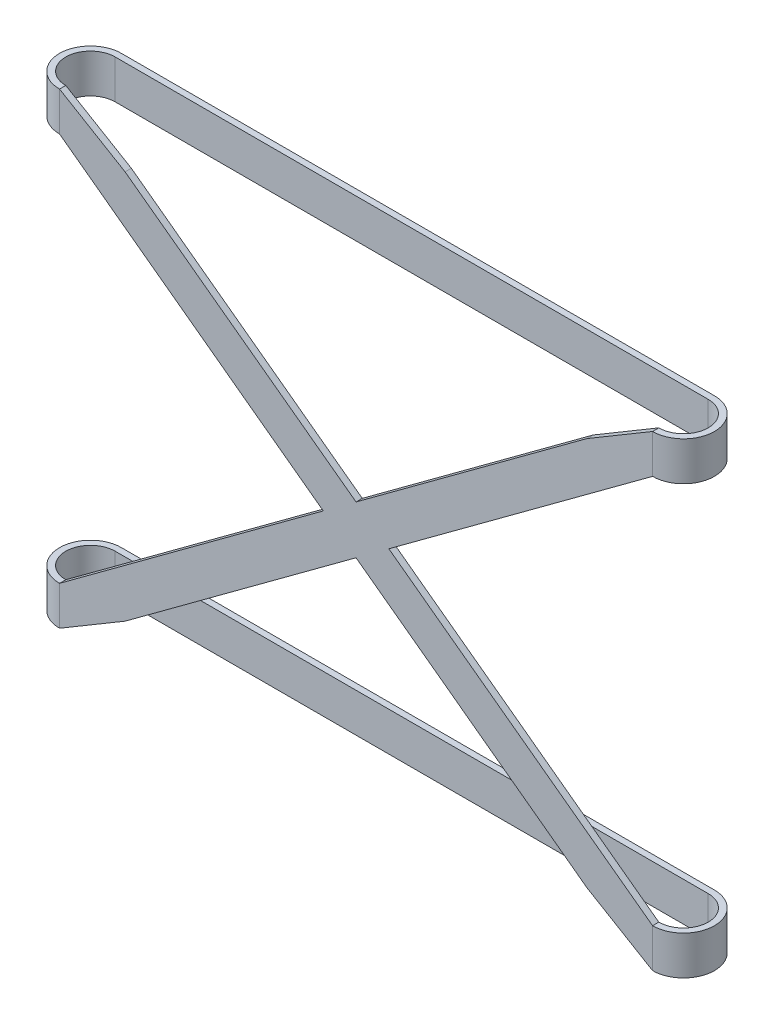
ISO-10303-21;
HEADER;
FILE_DESCRIPTION(('STEP AP214'),'2;1');
FILE_NAME('part.step','',(''),(''),'','','');
FILE_SCHEMA(('AUTOMOTIVE_DESIGN { 1 0 10303 214 1 1 1 1 }'));
ENDSEC;
DATA;
#1=APPLICATION_CONTEXT('core data for automotive mechanical design processes');
#2=APPLICATION_PROTOCOL_DEFINITION('international standard','automotive_design',2000,#1);
#3=PRODUCT_CONTEXT('',#1,'mechanical');
#4=PRODUCT('Part','Part','',(#3));
#5=PRODUCT_RELATED_PRODUCT_CATEGORY('part','',(#4));
#6=PRODUCT_DEFINITION_FORMATION('','',#4);
#7=PRODUCT_DEFINITION_CONTEXT('part definition',#1,'design');
#8=PRODUCT_DEFINITION('design','',#6,#7);
#9=PRODUCT_DEFINITION_SHAPE('','',#8);
#10=(LENGTH_UNIT() NAMED_UNIT(*) SI_UNIT(.MILLI.,.METRE.));
#11=(NAMED_UNIT(*) PLANE_ANGLE_UNIT() SI_UNIT($,.RADIAN.));
#12=(NAMED_UNIT(*) SI_UNIT($,.STERADIAN.) SOLID_ANGLE_UNIT());
#13=UNCERTAINTY_MEASURE_WITH_UNIT(LENGTH_MEASURE(1.E-05),#10,'distance_accuracy_value','');
#14=(GEOMETRIC_REPRESENTATION_CONTEXT(3) GLOBAL_UNCERTAINTY_ASSIGNED_CONTEXT((#13)) GLOBAL_UNIT_ASSIGNED_CONTEXT((#10,
#11,#12)) REPRESENTATION_CONTEXT('',''));
#15=CARTESIAN_POINT('',(0.,0.,0.));
#16=DIRECTION('',(0.,0.,1.));
#17=DIRECTION('',(1.,0.,0.));
#18=AXIS2_PLACEMENT_3D('',#15,#16,#17);
#19=CARTESIAN_POINT('',(0.,30.,-3.175));
#20=DIRECTION('',(0.,0.,1.));
#21=DIRECTION('',(1.,0.,0.));
#22=AXIS2_PLACEMENT_3D('',#19,#20,#21);
#23=PLANE('',#22);
#24=DIRECTION('',(1.,0.,0.));
#25=VECTOR('',#24,1.);
#26=CARTESIAN_POINT('',(0.,-30.,-3.175));
#27=LINE('',#26,#25);
#28=CARTESIAN_POINT('',(0.,-30.,-3.175));
#29=VERTEX_POINT('',#28);
#30=CARTESIAN_POINT('',(76.2,-30.,-3.175));
#31=VERTEX_POINT('',#30);
#32=EDGE_CURVE('E242',#29,#31,#27,.T.);
#33=ORIENTED_EDGE('',*,*,#32,.T.);
#34=DIRECTION('',(0.,-1.,0.));
#35=VECTOR('',#34,1.);
#36=CARTESIAN_POINT('',(76.2,30.,-3.175));
#37=LINE('',#36,#35);
#38=CARTESIAN_POINT('',(76.2,-25.,-3.175));
#39=VERTEX_POINT('',#38);
#40=EDGE_CURVE('E197',#31,#39,#37,.F.);
#41=ORIENTED_EDGE('',*,*,#40,.T.);
#42=DIRECTION('',(1.,0.,0.));
#43=VECTOR('',#42,1.);
#44=CARTESIAN_POINT('',(67.7775335807773,-25.,-3.175));
#45=LINE('',#44,#43);
#46=CARTESIAN_POINT('',(0.,-25.,-3.175));
#47=VERTEX_POINT('',#46);
#48=EDGE_CURVE('E246',#39,#47,#45,.F.);
#49=ORIENTED_EDGE('',*,*,#48,.T.);
#50=DIRECTION('',(0.,-1.,0.));
#51=VECTOR('',#50,1.);
#52=CARTESIAN_POINT('',(0.,30.,-3.175));
#53=LINE('',#52,#51);
#54=EDGE_CURVE('E141',#47,#29,#53,.T.);
#55=ORIENTED_EDGE('',*,*,#54,.T.);
#56=EDGE_LOOP('',(#33,#41,#49,#55));
#57=FACE_BOUND('',#56,.T.);
#58=ADVANCED_FACE('F16',(#57),#23,.T.);
#59=CARTESIAN_POINT('',(76.2,30.,0.));
#60=DIRECTION('',(0.,-1.,0.));
#61=DIRECTION('',(0.,0.,-1.));
#62=AXIS2_PLACEMENT_3D('',#59,#60,#61);
#63=CYLINDRICAL_SURFACE('',#62,3.175);
#64=ORIENTED_EDGE('',*,*,#40,.F.);
#65=CARTESIAN_POINT('',(76.2,-30.,0.));
#66=DIRECTION('',(0.,-1.,0.));
#67=DIRECTION('',(0.,0.,-1.));
#68=AXIS2_PLACEMENT_3D('',#65,#66,#67);
#69=CIRCLE('',#68,3.175);
#70=CARTESIAN_POINT('',(76.2,-30.,3.17500000000002));
#71=VERTEX_POINT('',#70);
#72=EDGE_CURVE('E238',#31,#71,#69,.T.);
#73=ORIENTED_EDGE('',*,*,#72,.T.);
#74=DIRECTION('',(0.,1.,0.));
#75=VECTOR('',#74,1.);
#76=CARTESIAN_POINT('',(76.2,30.,3.175));
#77=LINE('',#76,#75);
#78=CARTESIAN_POINT('',(76.2,-25.,3.175));
#79=VERTEX_POINT('',#78);
#80=EDGE_CURVE('E181',#79,#71,#77,.F.);
#81=ORIENTED_EDGE('',*,*,#80,.F.);
#82=CARTESIAN_POINT('',(76.2,-25.,0.));
#83=DIRECTION('',(0.,-1.,0.));
#84=DIRECTION('',(0.,0.,-1.));
#85=AXIS2_PLACEMENT_3D('',#82,#83,#84);
#86=CIRCLE('',#85,3.175);
#87=EDGE_CURVE('E156',#79,#39,#86,.F.);
#88=ORIENTED_EDGE('',*,*,#87,.T.);
#89=EDGE_LOOP('',(#64,#73,#81,#88));
#90=FACE_BOUND('',#89,.T.);
#91=ADVANCED_FACE('F758',(#90),#63,.F.);
#92=CARTESIAN_POINT('',(0.,30.,0.));
#93=DIRECTION('',(0.,-1.,0.));
#94=DIRECTION('',(0.,0.,-1.));
#95=AXIS2_PLACEMENT_3D('',#92,#93,#94);
#96=CYLINDRICAL_SURFACE('',#95,3.175);
#97=DIRECTION('',(0.,1.,0.));
#98=VECTOR('',#97,1.);
#99=CARTESIAN_POINT('',(0.,30.,3.175));
#100=LINE('',#99,#98);
#101=CARTESIAN_POINT('',(0.,-30.,3.175));
#102=VERTEX_POINT('',#101);
#103=CARTESIAN_POINT('',(0.,-25.,3.175));
#104=VERTEX_POINT('',#103);
#105=EDGE_CURVE('E173',#102,#104,#100,.T.);
#106=ORIENTED_EDGE('',*,*,#105,.F.);
#107=CARTESIAN_POINT('',(0.,-30.,0.));
#108=DIRECTION('',(0.,-1.,0.));
#109=DIRECTION('',(0.,0.,-1.));
#110=AXIS2_PLACEMENT_3D('',#107,#108,#109);
#111=CIRCLE('',#110,3.175);
#112=EDGE_CURVE('E243',#102,#29,#111,.T.);
#113=ORIENTED_EDGE('',*,*,#112,.T.);
#114=ORIENTED_EDGE('',*,*,#54,.F.);
#115=CARTESIAN_POINT('',(0.,-25.,0.));
#116=DIRECTION('',(0.,-1.,0.));
#117=DIRECTION('',(0.,0.,-1.));
#118=AXIS2_PLACEMENT_3D('',#115,#116,#117);
#119=CIRCLE('',#118,3.175);
#120=EDGE_CURVE('E19',#47,#104,#119,.F.);
#121=ORIENTED_EDGE('',*,*,#120,.T.);
#122=EDGE_LOOP('',(#106,#113,#114,#121));
#123=FACE_BOUND('',#122,.T.);
#124=ADVANCED_FACE('F183',(#123),#96,.F.);
#125=CARTESIAN_POINT('',(0.,30.,0.));
#126=DIRECTION('',(0.,-1.,0.));
#127=DIRECTION('',(0.,0.,-1.));
#128=AXIS2_PLACEMENT_3D('',#125,#126,#127);
#129=CYLINDRICAL_SURFACE('',#128,3.175);
#130=DIRECTION('',(0.,1.,0.));
#131=VECTOR('',#130,1.);
#132=CARTESIAN_POINT('',(0.,30.,-3.175));
#133=LINE('',#132,#131);
#134=CARTESIAN_POINT('',(0.,30.,-3.175));
#135=VERTEX_POINT('',#134);
#136=CARTESIAN_POINT('',(0.,25.,-3.175));
#137=VERTEX_POINT('',#136);
#138=EDGE_CURVE('E186',#135,#137,#133,.F.);
#139=ORIENTED_EDGE('',*,*,#138,.F.);
#140=CARTESIAN_POINT('',(0.,30.,0.));
#141=DIRECTION('',(0.,-1.,0.));
#142=DIRECTION('',(0.,0.,-1.));
#143=AXIS2_PLACEMENT_3D('',#140,#141,#142);
#144=CIRCLE('',#143,3.175);
#145=CARTESIAN_POINT('',(0.,30.,3.175));
#146=VERTEX_POINT('',#145);
#147=EDGE_CURVE('E228',#146,#135,#144,.T.);
#148=ORIENTED_EDGE('',*,*,#147,.F.);
#149=DIRECTION('',(0.,1.,0.));
#150=VECTOR('',#149,1.);
#151=CARTESIAN_POINT('',(0.,30.,3.175));
#152=LINE('',#151,#150);
#153=CARTESIAN_POINT('',(0.,25.,3.175));
#154=VERTEX_POINT('',#153);
#155=EDGE_CURVE('E180',#154,#146,#152,.T.);
#156=ORIENTED_EDGE('',*,*,#155,.F.);
#157=CARTESIAN_POINT('',(0.,25.,0.));
#158=DIRECTION('',(0.,-1.,0.));
#159=DIRECTION('',(0.,0.,-1.));
#160=AXIS2_PLACEMENT_3D('',#157,#158,#159);
#161=CIRCLE('',#160,3.175);
#162=EDGE_CURVE('E231',#154,#137,#161,.T.);
#163=ORIENTED_EDGE('',*,*,#162,.T.);
#164=EDGE_LOOP('',(#139,#148,#156,#163));
#165=FACE_BOUND('',#164,.T.);
#166=ADVANCED_FACE('F506',(#165),#129,.F.);
#167=CARTESIAN_POINT('',(0.,30.,-3.175));
#168=DIRECTION('',(0.,0.,1.));
#169=DIRECTION('',(1.,0.,0.));
#170=AXIS2_PLACEMENT_3D('',#167,#168,#169);
#171=PLANE('',#170);
#172=DIRECTION('',(1.,0.,0.));
#173=VECTOR('',#172,1.);
#174=CARTESIAN_POINT('',(0.,30.,-3.175));
#175=LINE('',#174,#173);
#176=CARTESIAN_POINT('',(76.2,30.,-3.175));
#177=VERTEX_POINT('',#176);
#178=EDGE_CURVE('E227',#135,#177,#175,.T.);
#179=ORIENTED_EDGE('',*,*,#178,.F.);
#180=ORIENTED_EDGE('',*,*,#138,.T.);
#181=DIRECTION('',(1.,0.,0.));
#182=VECTOR('',#181,1.);
#183=CARTESIAN_POINT('',(67.7775335807773,25.,-3.175));
#184=LINE('',#183,#182);
#185=CARTESIAN_POINT('',(76.2,25.,-3.175));
#186=VERTEX_POINT('',#185);
#187=EDGE_CURVE('E234',#137,#186,#184,.T.);
#188=ORIENTED_EDGE('',*,*,#187,.T.);
#189=DIRECTION('',(0.,-1.,0.));
#190=VECTOR('',#189,1.);
#191=CARTESIAN_POINT('',(76.2,30.,-3.175));
#192=LINE('',#191,#190);
#193=EDGE_CURVE('E184',#186,#177,#192,.F.);
#194=ORIENTED_EDGE('',*,*,#193,.T.);
#195=EDGE_LOOP('',(#179,#180,#188,#194));
#196=FACE_BOUND('',#195,.T.);
#197=ADVANCED_FACE('F526',(#196),#171,.T.);
#198=CARTESIAN_POINT('',(76.2,30.,0.));
#199=DIRECTION('',(0.,-1.,0.));
#200=DIRECTION('',(0.,0.,-1.));
#201=AXIS2_PLACEMENT_3D('',#198,#199,#200);
#202=CYLINDRICAL_SURFACE('',#201,3.175);
#203=DIRECTION('',(0.,1.,0.));
#204=VECTOR('',#203,1.);
#205=CARTESIAN_POINT('',(76.2,30.,3.175));
#206=LINE('',#205,#204);
#207=CARTESIAN_POINT('',(76.2,30.,3.175));
#208=VERTEX_POINT('',#207);
#209=CARTESIAN_POINT('',(76.2,25.,3.175));
#210=VERTEX_POINT('',#209);
#211=EDGE_CURVE('E241',#208,#210,#206,.F.);
#212=ORIENTED_EDGE('',*,*,#211,.F.);
#213=CARTESIAN_POINT('',(76.2,30.,0.));
#214=DIRECTION('',(0.,-1.,0.));
#215=DIRECTION('',(0.,0.,-1.));
#216=AXIS2_PLACEMENT_3D('',#213,#214,#215);
#217=CIRCLE('',#216,3.175);
#218=EDGE_CURVE('E224',#177,#208,#217,.T.);
#219=ORIENTED_EDGE('',*,*,#218,.F.);
#220=ORIENTED_EDGE('',*,*,#193,.F.);
#221=CARTESIAN_POINT('',(76.2,25.,0.));
#222=DIRECTION('',(0.,-1.,0.));
#223=DIRECTION('',(0.,0.,-1.));
#224=AXIS2_PLACEMENT_3D('',#221,#222,#223);
#225=CIRCLE('',#224,3.175);
#226=EDGE_CURVE('E235',#186,#210,#225,.T.);
#227=ORIENTED_EDGE('',*,*,#226,.T.);
#228=EDGE_LOOP('',(#212,#219,#220,#227));
#229=FACE_BOUND('',#228,.T.);
#230=ADVANCED_FACE('F525',(#229),#202,.F.);
#231=CARTESIAN_POINT('',(67.7775335807773,-25.,3.975));
#232=DIRECTION('',(0.,-1.,0.));
#233=DIRECTION('',(0.,0.,-1.));
#234=AXIS2_PLACEMENT_3D('',#231,#232,#233);
#235=PLANE('',#234);
#236=ORIENTED_EDGE('',*,*,#87,.F.);
#237=DIRECTION('',(0.,0.,1.));
#238=VECTOR('',#237,1.);
#239=CARTESIAN_POINT('',(76.2,-25.,3.975));
#240=LINE('',#239,#238);
#241=CARTESIAN_POINT('',(76.2,-25.,3.975));
#242=VERTEX_POINT('',#241);
#243=EDGE_CURVE('E317',#79,#242,#240,.T.);
#244=ORIENTED_EDGE('',*,*,#243,.T.);
#245=CARTESIAN_POINT('',(76.2,-25.,0.));
#246=DIRECTION('',(0.,-1.,0.));
#247=DIRECTION('',(0.,0.,-1.));
#248=AXIS2_PLACEMENT_3D('',#245,#246,#247);
#249=CIRCLE('',#248,3.975);
#250=CARTESIAN_POINT('',(76.2,-25.,-3.975));
#251=VERTEX_POINT('',#250);
#252=EDGE_CURVE('E221',#251,#242,#249,.T.);
#253=ORIENTED_EDGE('',*,*,#252,.F.);
#254=DIRECTION('',(1.,0.,0.));
#255=VECTOR('',#254,1.);
#256=CARTESIAN_POINT('',(0.,-25.,-3.975));
#257=LINE('',#256,#255);
#258=CARTESIAN_POINT('',(0.,-25.,-3.975));
#259=VERTEX_POINT('',#258);
#260=EDGE_CURVE('E249',#251,#259,#257,.F.);
#261=ORIENTED_EDGE('',*,*,#260,.T.);
#262=CARTESIAN_POINT('',(0.,-25.,0.));
#263=DIRECTION('',(0.,-1.,0.));
#264=DIRECTION('',(0.,0.,-1.));
#265=AXIS2_PLACEMENT_3D('',#262,#263,#264);
#266=CIRCLE('',#265,3.975);
#267=CARTESIAN_POINT('',(0.,-25.,3.975));
#268=VERTEX_POINT('',#267);
#269=EDGE_CURVE('E152',#268,#259,#266,.T.);
#270=ORIENTED_EDGE('',*,*,#269,.F.);
#271=DIRECTION('',(0.,0.,-1.));
#272=VECTOR('',#271,1.);
#273=CARTESIAN_POINT('',(0.,-25.,3.975));
#274=LINE('',#273,#272);
#275=EDGE_CURVE('E146',#104,#268,#274,.F.);
#276=ORIENTED_EDGE('',*,*,#275,.F.);
#277=ORIENTED_EDGE('',*,*,#120,.F.);
#278=ORIENTED_EDGE('',*,*,#48,.F.);
#279=EDGE_LOOP('',(#236,#244,#253,#261,#270,#276,#277,#278));
#280=FACE_BOUND('',#279,.T.);
#281=ADVANCED_FACE('F148',(#280),#235,.F.);
#282=CARTESIAN_POINT('',(0.,30.,-3.975));
#283=DIRECTION('',(0.,0.,1.));
#284=DIRECTION('',(1.,0.,0.));
#285=AXIS2_PLACEMENT_3D('',#282,#283,#284);
#286=PLANE('',#285);
#287=ORIENTED_EDGE('',*,*,#260,.F.);
#288=DIRECTION('',(0.,-1.,0.));
#289=VECTOR('',#288,1.);
#290=CARTESIAN_POINT('',(76.2,30.,-3.975));
#291=LINE('',#290,#289);
#292=CARTESIAN_POINT('',(76.2,-30.,-3.975));
#293=VERTEX_POINT('',#292);
#294=EDGE_CURVE('E220',#293,#251,#291,.F.);
#295=ORIENTED_EDGE('',*,*,#294,.F.);
#296=DIRECTION('',(1.,0.,0.));
#297=VECTOR('',#296,1.);
#298=CARTESIAN_POINT('',(0.,-30.,-3.975));
#299=LINE('',#298,#297);
#300=CARTESIAN_POINT('',(0.,-30.,-3.975));
#301=VERTEX_POINT('',#300);
#302=EDGE_CURVE('E244',#293,#301,#299,.F.);
#303=ORIENTED_EDGE('',*,*,#302,.T.);
#304=DIRECTION('',(0.,-1.,0.));
#305=VECTOR('',#304,1.);
#306=CARTESIAN_POINT('',(0.,30.,-3.975));
#307=LINE('',#306,#305);
#308=EDGE_CURVE('E214',#259,#301,#307,.T.);
#309=ORIENTED_EDGE('',*,*,#308,.F.);
#310=EDGE_LOOP('',(#287,#295,#303,#309));
#311=FACE_BOUND('',#310,.T.);
#312=ADVANCED_FACE('F459',(#311),#286,.F.);
#313=CARTESIAN_POINT('',(0.,-30.,0.));
#314=DIRECTION('',(0.,1.,0.));
#315=DIRECTION('',(0.,0.,1.));
#316=AXIS2_PLACEMENT_3D('',#313,#314,#315);
#317=PLANE('',#316);
#318=DIRECTION('',(0.,0.,1.));
#319=VECTOR('',#318,1.);
#320=CARTESIAN_POINT('',(76.2,-30.,-73.1888658005211));
#321=LINE('',#320,#319);
#322=CARTESIAN_POINT('',(76.2,-30.,3.975));
#323=VERTEX_POINT('',#322);
#324=EDGE_CURVE('E296',#323,#71,#321,.F.);
#325=ORIENTED_EDGE('',*,*,#324,.T.);
#326=ORIENTED_EDGE('',*,*,#72,.F.);
#327=ORIENTED_EDGE('',*,*,#32,.F.);
#328=ORIENTED_EDGE('',*,*,#112,.F.);
#329=DIRECTION('',(0.,0.,1.));
#330=VECTOR('',#329,1.);
#331=CARTESIAN_POINT('',(0.,-30.,-73.1888658005211));
#332=LINE('',#331,#330);
#333=CARTESIAN_POINT('',(0.,-30.,3.975));
#334=VERTEX_POINT('',#333);
#335=EDGE_CURVE('E260',#102,#334,#332,.T.);
#336=ORIENTED_EDGE('',*,*,#335,.T.);
#337=CARTESIAN_POINT('',(0.,-30.,0.));
#338=DIRECTION('',(0.,-1.,0.));
#339=DIRECTION('',(0.,0.,-1.));
#340=AXIS2_PLACEMENT_3D('',#337,#338,#339);
#341=CIRCLE('',#340,3.975);
#342=EDGE_CURVE('E169',#301,#334,#341,.F.);
#343=ORIENTED_EDGE('',*,*,#342,.F.);
#344=ORIENTED_EDGE('',*,*,#302,.F.);
#345=CARTESIAN_POINT('',(76.2,-30.,0.));
#346=DIRECTION('',(0.,-1.,0.));
#347=DIRECTION('',(0.,0.,-1.));
#348=AXIS2_PLACEMENT_3D('',#345,#346,#347);
#349=CIRCLE('',#348,3.975);
#350=EDGE_CURVE('E217',#323,#293,#349,.F.);
#351=ORIENTED_EDGE('',*,*,#350,.F.);
#352=EDGE_LOOP('',(#325,#326,#327,#328,#336,#343,#344,#351));
#353=FACE_BOUND('',#352,.T.);
#354=ADVANCED_FACE('F452',(#353),#317,.F.);
#355=CARTESIAN_POINT('',(0.,30.,3.175));
#356=DIRECTION('',(0.,0.,-1.));
#357=DIRECTION('',(-1.,0.,0.));
#358=AXIS2_PLACEMENT_3D('',#355,#356,#357);
#359=PLANE('',#358);
#360=DIRECTION('',(0.804723108495723,-0.593650333658611,0.));
#361=VECTOR('',#360,1.);
#362=CARTESIAN_POINT('',(38.1,3.10665864271411,3.175));
#363=LINE('',#362,#361);
#364=CARTESIAN_POINT('',(8.4224664192227,25.,3.175));
#365=VERTEX_POINT('',#364);
#366=CARTESIAN_POINT('',(38.1,3.10665864271411,3.175));
#367=VERTEX_POINT('',#366);
#368=EDGE_CURVE('E366',#365,#367,#363,.T.);
#369=ORIENTED_EDGE('',*,*,#368,.T.);
#370=DIRECTION('',(0.804723108495723,0.593650333658611,0.));
#371=VECTOR('',#370,1.);
#372=CARTESIAN_POINT('',(38.1,3.10665864271411,3.175));
#373=LINE('',#372,#371);
#374=CARTESIAN_POINT('',(67.7775335807773,25.,3.175));
#375=VERTEX_POINT('',#374);
#376=EDGE_CURVE('E351',#367,#375,#373,.T.);
#377=ORIENTED_EDGE('',*,*,#376,.T.);
#378=DIRECTION('',(0.859892363898923,0.510475388739088,0.));
#379=VECTOR('',#378,1.);
#380=CARTESIAN_POINT('',(67.7775335807773,25.,3.175));
#381=LINE('',#380,#379);
#382=EDGE_CURVE('E338',#375,#208,#381,.T.);
#383=ORIENTED_EDGE('',*,*,#382,.T.);
#384=ORIENTED_EDGE('',*,*,#211,.T.);
#385=DIRECTION('',(-0.804723108495723,-0.593650333658611,0.));
#386=VECTOR('',#385,1.);
#387=CARTESIAN_POINT('',(76.2,25.,3.175));
#388=LINE('',#387,#386);
#389=CARTESIAN_POINT('',(42.3112332096113,0.,3.175));
#390=VERTEX_POINT('',#389);
#391=EDGE_CURVE('E194',#210,#390,#388,.T.);
#392=ORIENTED_EDGE('',*,*,#391,.T.);
#393=DIRECTION('',(0.804723108495723,-0.593650333658611,0.));
#394=VECTOR('',#393,1.);
#395=CARTESIAN_POINT('',(76.2,-25.,3.175));
#396=LINE('',#395,#394);
#397=EDGE_CURVE('E223',#390,#79,#396,.T.);
#398=ORIENTED_EDGE('',*,*,#397,.T.);
#399=ORIENTED_EDGE('',*,*,#80,.T.);
#400=DIRECTION('',(-0.859892363898923,0.510475388739088,0.));
#401=VECTOR('',#400,1.);
#402=CARTESIAN_POINT('',(67.7775335807773,-25.,3.17500000000001));
#403=LINE('',#402,#401);
#404=CARTESIAN_POINT('',(67.7775335807773,-25.,3.17499999999997));
#405=VERTEX_POINT('',#404);
#406=EDGE_CURVE('E299',#71,#405,#403,.T.);
#407=ORIENTED_EDGE('',*,*,#406,.T.);
#408=DIRECTION('',(-0.804723108495723,0.593650333658611,0.));
#409=VECTOR('',#408,1.);
#410=CARTESIAN_POINT('',(67.7775335807773,-25.,3.17499999999996));
#411=LINE('',#410,#409);
#412=CARTESIAN_POINT('',(38.1,-3.1066586427141,3.17499999999999));
#413=VERTEX_POINT('',#412);
#414=EDGE_CURVE('E274',#405,#413,#411,.T.);
#415=ORIENTED_EDGE('',*,*,#414,.T.);
#416=DIRECTION('',(-0.804723108495723,-0.593650333658611,0.));
#417=VECTOR('',#416,1.);
#418=CARTESIAN_POINT('',(38.1,-3.1066586427141,3.175));
#419=LINE('',#418,#417);
#420=CARTESIAN_POINT('',(8.4224664192227,-25.,3.175));
#421=VERTEX_POINT('',#420);
#422=EDGE_CURVE('E261',#413,#421,#419,.T.);
#423=ORIENTED_EDGE('',*,*,#422,.T.);
#424=DIRECTION('',(-0.859892363898923,-0.510475388739087,0.));
#425=VECTOR('',#424,1.);
#426=CARTESIAN_POINT('',(8.4224664192227,-25.,3.175));
#427=LINE('',#426,#425);
#428=EDGE_CURVE('E178',#421,#102,#427,.T.);
#429=ORIENTED_EDGE('',*,*,#428,.T.);
#430=ORIENTED_EDGE('',*,*,#105,.T.);
#431=DIRECTION('',(0.804723108495723,0.593650333658611,0.));
#432=VECTOR('',#431,1.);
#433=CARTESIAN_POINT('',(0.,-25.,3.175));
#434=LINE('',#433,#432);
#435=CARTESIAN_POINT('',(33.8887667903887,0.,3.175));
#436=VERTEX_POINT('',#435);
#437=EDGE_CURVE('E160',#104,#436,#434,.T.);
#438=ORIENTED_EDGE('',*,*,#437,.T.);
#439=DIRECTION('',(-0.804723108495723,0.593650333658611,0.));
#440=VECTOR('',#439,1.);
#441=CARTESIAN_POINT('',(33.8887667903887,0.,3.175));
#442=LINE('',#441,#440);
#443=EDGE_CURVE('E212',#436,#154,#442,.T.);
#444=ORIENTED_EDGE('',*,*,#443,.T.);
#445=ORIENTED_EDGE('',*,*,#155,.T.);
#446=DIRECTION('',(0.859892363898923,-0.510475388739087,0.));
#447=VECTOR('',#446,1.);
#448=CARTESIAN_POINT('',(8.4224664192227,25.,3.175));
#449=LINE('',#448,#447);
#450=EDGE_CURVE('E388',#146,#365,#449,.T.);
#451=ORIENTED_EDGE('',*,*,#450,.T.);
#452=EDGE_LOOP('',(#369,#377,#383,#384,#392,#398,#399,#407,#415,#423,#429,#430,#438,#444,#445,#451));
#453=FACE_BOUND('',#452,.T.);
#454=ADVANCED_FACE('F175',(#453),#359,.T.);
#455=CARTESIAN_POINT('',(67.7775335807773,25.,3.975));
#456=DIRECTION('',(0.,1.,0.));
#457=DIRECTION('',(0.,0.,1.));
#458=AXIS2_PLACEMENT_3D('',#455,#456,#457);
#459=PLANE('',#458);
#460=ORIENTED_EDGE('',*,*,#162,.F.);
#461=DIRECTION('',(0.,0.,1.));
#462=VECTOR('',#461,1.);
#463=CARTESIAN_POINT('',(0.,25.,3.975));
#464=LINE('',#463,#462);
#465=CARTESIAN_POINT('',(0.,25.,3.975));
#466=VERTEX_POINT('',#465);
#467=EDGE_CURVE('E168',#154,#466,#464,.T.);
#468=ORIENTED_EDGE('',*,*,#467,.T.);
#469=CARTESIAN_POINT('',(0.,25.,0.));
#470=DIRECTION('',(0.,-1.,0.));
#471=DIRECTION('',(0.,0.,-1.));
#472=AXIS2_PLACEMENT_3D('',#469,#470,#471);
#473=CIRCLE('',#472,3.975);
#474=CARTESIAN_POINT('',(0.,25.,-3.975));
#475=VERTEX_POINT('',#474);
#476=EDGE_CURVE('E210',#475,#466,#473,.F.);
#477=ORIENTED_EDGE('',*,*,#476,.F.);
#478=DIRECTION('',(1.,0.,0.));
#479=VECTOR('',#478,1.);
#480=CARTESIAN_POINT('',(0.,25.,-3.975));
#481=LINE('',#480,#479);
#482=CARTESIAN_POINT('',(76.2,25.,-3.975));
#483=VERTEX_POINT('',#482);
#484=EDGE_CURVE('E335',#475,#483,#481,.T.);
#485=ORIENTED_EDGE('',*,*,#484,.T.);
#486=CARTESIAN_POINT('',(76.2,25.,0.));
#487=DIRECTION('',(0.,-1.,0.));
#488=DIRECTION('',(0.,0.,-1.));
#489=AXIS2_PLACEMENT_3D('',#486,#487,#488);
#490=CIRCLE('',#489,3.975);
#491=CARTESIAN_POINT('',(76.2,25.,3.975));
#492=VERTEX_POINT('',#491);
#493=EDGE_CURVE('E203',#492,#483,#490,.F.);
#494=ORIENTED_EDGE('',*,*,#493,.F.);
#495=DIRECTION('',(0.,0.,1.));
#496=VECTOR('',#495,1.);
#497=CARTESIAN_POINT('',(76.2,25.,3.975));
#498=LINE('',#497,#496);
#499=EDGE_CURVE('E226',#492,#210,#498,.F.);
#500=ORIENTED_EDGE('',*,*,#499,.T.);
#501=ORIENTED_EDGE('',*,*,#226,.F.);
#502=ORIENTED_EDGE('',*,*,#187,.F.);
#503=EDGE_LOOP('',(#460,#468,#477,#485,#494,#500,#501,#502));
#504=FACE_BOUND('',#503,.T.);
#505=ADVANCED_FACE('F500',(#504),#459,.F.);
#506=CARTESIAN_POINT('',(0.,30.,-3.975));
#507=DIRECTION('',(0.,0.,1.));
#508=DIRECTION('',(1.,0.,0.));
#509=AXIS2_PLACEMENT_3D('',#506,#507,#508);
#510=PLANE('',#509);
#511=ORIENTED_EDGE('',*,*,#484,.F.);
#512=DIRECTION('',(0.,-1.,0.));
#513=VECTOR('',#512,1.);
#514=CARTESIAN_POINT('',(0.,30.,-3.975));
#515=LINE('',#514,#513);
#516=CARTESIAN_POINT('',(0.,30.,-3.975));
#517=VERTEX_POINT('',#516);
#518=EDGE_CURVE('E209',#517,#475,#515,.T.);
#519=ORIENTED_EDGE('',*,*,#518,.F.);
#520=DIRECTION('',(1.,0.,0.));
#521=VECTOR('',#520,1.);
#522=CARTESIAN_POINT('',(0.,30.,-3.975));
#523=LINE('',#522,#521);
#524=CARTESIAN_POINT('',(76.2,30.,-3.975));
#525=VERTEX_POINT('',#524);
#526=EDGE_CURVE('E230',#525,#517,#523,.F.);
#527=ORIENTED_EDGE('',*,*,#526,.F.);
#528=DIRECTION('',(0.,-1.,0.));
#529=VECTOR('',#528,1.);
#530=CARTESIAN_POINT('',(76.2,30.,-3.975));
#531=LINE('',#530,#529);
#532=EDGE_CURVE('E202',#483,#525,#531,.F.);
#533=ORIENTED_EDGE('',*,*,#532,.F.);
#534=EDGE_LOOP('',(#511,#519,#527,#533));
#535=FACE_BOUND('',#534,.T.);
#536=ADVANCED_FACE('F512',(#535),#510,.F.);
#537=CARTESIAN_POINT('',(0.,30.,0.));
#538=DIRECTION('',(0.,1.,0.));
#539=DIRECTION('',(0.,0.,1.));
#540=AXIS2_PLACEMENT_3D('',#537,#538,#539);
#541=PLANE('',#540);
#542=ORIENTED_EDGE('',*,*,#178,.T.);
#543=ORIENTED_EDGE('',*,*,#218,.T.);
#544=DIRECTION('',(0.,0.,1.));
#545=VECTOR('',#544,1.);
#546=CARTESIAN_POINT('',(76.2,30.,-73.1888658005211));
#547=LINE('',#546,#545);
#548=CARTESIAN_POINT('',(76.2,30.,3.975));
#549=VERTEX_POINT('',#548);
#550=EDGE_CURVE('E337',#208,#549,#547,.T.);
#551=ORIENTED_EDGE('',*,*,#550,.T.);
#552=CARTESIAN_POINT('',(76.2,30.,0.));
#553=DIRECTION('',(0.,-1.,0.));
#554=DIRECTION('',(0.,0.,-1.));
#555=AXIS2_PLACEMENT_3D('',#552,#553,#554);
#556=CIRCLE('',#555,3.975);
#557=EDGE_CURVE('E33',#525,#549,#556,.T.);
#558=ORIENTED_EDGE('',*,*,#557,.F.);
#559=ORIENTED_EDGE('',*,*,#526,.T.);
#560=CARTESIAN_POINT('',(0.,30.,0.));
#561=DIRECTION('',(0.,-1.,0.));
#562=DIRECTION('',(0.,0.,-1.));
#563=AXIS2_PLACEMENT_3D('',#560,#561,#562);
#564=CIRCLE('',#563,3.975);
#565=CARTESIAN_POINT('',(0.,30.,3.975));
#566=VERTEX_POINT('',#565);
#567=EDGE_CURVE('E206',#566,#517,#564,.T.);
#568=ORIENTED_EDGE('',*,*,#567,.F.);
#569=DIRECTION('',(0.,0.,1.));
#570=VECTOR('',#569,1.);
#571=CARTESIAN_POINT('',(0.,30.,-73.1888658005211));
#572=LINE('',#571,#570);
#573=EDGE_CURVE('E385',#566,#146,#572,.F.);
#574=ORIENTED_EDGE('',*,*,#573,.T.);
#575=ORIENTED_EDGE('',*,*,#147,.T.);
#576=EDGE_LOOP('',(#542,#543,#551,#558,#559,#568,#574,#575));
#577=FACE_BOUND('',#576,.T.);
#578=ADVANCED_FACE('F508',(#577),#541,.T.);
#579=CARTESIAN_POINT('',(76.2,25.,3.975));
#580=DIRECTION('',(-0.593650333658611,0.804723108495723,0.));
#581=DIRECTION('',(-0.804723108495723,-0.593650333658611,0.));
#582=AXIS2_PLACEMENT_3D('',#579,#580,#581);
#583=PLANE('',#582);
#584=ORIENTED_EDGE('',*,*,#499,.F.);
#585=DIRECTION('',(-0.804723108495723,-0.593650333658611,0.));
#586=VECTOR('',#585,1.);
#587=CARTESIAN_POINT('',(76.2,25.,3.975));
#588=LINE('',#587,#586);
#589=CARTESIAN_POINT('',(42.3112332096113,0.,3.975));
#590=VERTEX_POINT('',#589);
#591=EDGE_CURVE('E201',#492,#590,#588,.T.);
#592=ORIENTED_EDGE('',*,*,#591,.T.);
#593=DIRECTION('',(0.,0.,1.));
#594=VECTOR('',#593,1.);
#595=CARTESIAN_POINT('',(42.3112332096114,0.,3.975));
#596=LINE('',#595,#594);
#597=EDGE_CURVE('E320',#590,#390,#596,.F.);
#598=ORIENTED_EDGE('',*,*,#597,.T.);
#599=ORIENTED_EDGE('',*,*,#391,.F.);
#600=EDGE_LOOP('',(#584,#592,#598,#599));
#601=FACE_BOUND('',#600,.T.);
#602=ADVANCED_FACE('F517',(#601),#583,.F.);
#603=CARTESIAN_POINT('',(76.2,-25.,3.975));
#604=DIRECTION('',(-0.593650333658611,-0.804723108495723,0.));
#605=DIRECTION('',(0.804723108495723,-0.593650333658611,0.));
#606=AXIS2_PLACEMENT_3D('',#603,#604,#605);
#607=PLANE('',#606);
#608=ORIENTED_EDGE('',*,*,#597,.F.);
#609=DIRECTION('',(0.804723108495723,-0.593650333658611,0.));
#610=VECTOR('',#609,1.);
#611=CARTESIAN_POINT('',(42.3112332096113,0.,3.975));
#612=LINE('',#611,#610);
#613=EDGE_CURVE('E313',#590,#242,#612,.T.);
#614=ORIENTED_EDGE('',*,*,#613,.T.);
#615=ORIENTED_EDGE('',*,*,#243,.F.);
#616=ORIENTED_EDGE('',*,*,#397,.F.);
#617=EDGE_LOOP('',(#608,#614,#615,#616));
#618=FACE_BOUND('',#617,.T.);
#619=ADVANCED_FACE('F465',(#618),#607,.F.);
#620=CARTESIAN_POINT('',(76.2,30.,0.));
#621=DIRECTION('',(0.,-1.,0.));
#622=DIRECTION('',(0.,0.,-1.));
#623=AXIS2_PLACEMENT_3D('',#620,#621,#622);
#624=CYLINDRICAL_SURFACE('',#623,3.975);
#625=ORIENTED_EDGE('',*,*,#350,.T.);
#626=ORIENTED_EDGE('',*,*,#294,.T.);
#627=ORIENTED_EDGE('',*,*,#252,.T.);
#628=DIRECTION('',(0.,1.,0.));
#629=VECTOR('',#628,1.);
#630=CARTESIAN_POINT('',(76.2,30.,3.975));
#631=LINE('',#630,#629);
#632=EDGE_CURVE('E306',#242,#323,#631,.F.);
#633=ORIENTED_EDGE('',*,*,#632,.T.);
#634=EDGE_LOOP('',(#625,#626,#627,#633));
#635=FACE_BOUND('',#634,.T.);
#636=ADVANCED_FACE('F456',(#635),#624,.T.);
#637=CARTESIAN_POINT('',(67.7775335807773,-25.,-73.1888658005211));
#638=DIRECTION('',(0.510475388739088,0.859892363898923,0.));
#639=DIRECTION('',(-0.859892363898923,0.510475388739088,0.));
#640=AXIS2_PLACEMENT_3D('',#637,#638,#639);
#641=PLANE('',#640);
#642=DIRECTION('',(-0.859892363898923,0.510475388739088,0.));
#643=VECTOR('',#642,1.);
#644=CARTESIAN_POINT('',(76.2,-30.,3.975));
#645=LINE('',#644,#643);
#646=CARTESIAN_POINT('',(67.7775335807773,-25.,3.97500000000001));
#647=VERTEX_POINT('',#646);
#648=EDGE_CURVE('E291',#323,#647,#645,.T.);
#649=ORIENTED_EDGE('',*,*,#648,.T.);
#650=DIRECTION('',(0.,0.,1.));
#651=VECTOR('',#650,1.);
#652=CARTESIAN_POINT('',(67.7775335807773,-25.,3.975));
#653=LINE('',#652,#651);
#654=EDGE_CURVE('E279',#647,#405,#653,.F.);
#655=ORIENTED_EDGE('',*,*,#654,.T.);
#656=ORIENTED_EDGE('',*,*,#406,.F.);
#657=ORIENTED_EDGE('',*,*,#324,.F.);
#658=EDGE_LOOP('',(#649,#655,#656,#657));
#659=FACE_BOUND('',#658,.T.);
#660=ADVANCED_FACE('F448',(#659),#641,.F.);
#661=CARTESIAN_POINT('',(67.7775335807773,-25.,3.975));
#662=DIRECTION('',(0.593650333658611,0.804723108495723,0.));
#663=DIRECTION('',(-0.804723108495723,0.593650333658611,0.));
#664=AXIS2_PLACEMENT_3D('',#661,#662,#663);
#665=PLANE('',#664);
#666=ORIENTED_EDGE('',*,*,#654,.F.);
#667=DIRECTION('',(-0.804723108495724,0.593650333658611,0.));
#668=VECTOR('',#667,1.);
#669=CARTESIAN_POINT('',(67.7775335807773,-25.,3.975));
#670=LINE('',#669,#668);
#671=CARTESIAN_POINT('',(38.1,-3.1066586427141,3.975));
#672=VERTEX_POINT('',#671);
#673=EDGE_CURVE('E286',#647,#672,#670,.T.);
#674=ORIENTED_EDGE('',*,*,#673,.T.);
#675=DIRECTION('',(0.,0.,1.));
#676=VECTOR('',#675,1.);
#677=CARTESIAN_POINT('',(38.1,-3.1066586427141,3.975));
#678=LINE('',#677,#676);
#679=EDGE_CURVE('E265',#672,#413,#678,.F.);
#680=ORIENTED_EDGE('',*,*,#679,.T.);
#681=ORIENTED_EDGE('',*,*,#414,.F.);
#682=EDGE_LOOP('',(#666,#674,#680,#681));
#683=FACE_BOUND('',#682,.T.);
#684=ADVANCED_FACE('F440',(#683),#665,.F.);
#685=CARTESIAN_POINT('',(38.1,-3.1066586427141,3.975));
#686=DIRECTION('',(-0.593650333658611,0.804723108495723,0.));
#687=DIRECTION('',(-0.804723108495723,-0.593650333658611,0.));
#688=AXIS2_PLACEMENT_3D('',#685,#686,#687);
#689=PLANE('',#688);
#690=ORIENTED_EDGE('',*,*,#679,.F.);
#691=DIRECTION('',(-0.804723108495723,-0.593650333658611,0.));
#692=VECTOR('',#691,1.);
#693=CARTESIAN_POINT('',(38.1,-3.10665864271411,3.975));
#694=LINE('',#693,#692);
#695=CARTESIAN_POINT('',(8.42246641922267,-25.,3.975));
#696=VERTEX_POINT('',#695);
#697=EDGE_CURVE('E282',#672,#696,#694,.T.);
#698=ORIENTED_EDGE('',*,*,#697,.T.);
#699=DIRECTION('',(0.,0.,1.));
#700=VECTOR('',#699,1.);
#701=CARTESIAN_POINT('',(8.4224664192227,-25.,-73.1888658005211));
#702=LINE('',#701,#700);
#703=EDGE_CURVE('E216',#696,#421,#702,.F.);
#704=ORIENTED_EDGE('',*,*,#703,.T.);
#705=ORIENTED_EDGE('',*,*,#422,.F.);
#706=EDGE_LOOP('',(#690,#698,#704,#705));
#707=FACE_BOUND('',#706,.T.);
#708=ADVANCED_FACE('F433',(#707),#689,.F.);
#709=CARTESIAN_POINT('',(8.4224664192227,-25.,-73.1888658005211));
#710=DIRECTION('',(-0.510475388739087,0.859892363898923,0.));
#711=DIRECTION('',(-0.859892363898923,-0.510475388739087,0.));
#712=AXIS2_PLACEMENT_3D('',#709,#710,#711);
#713=PLANE('',#712);
#714=DIRECTION('',(-0.859892363898923,-0.510475388739087,0.));
#715=VECTOR('',#714,1.);
#716=CARTESIAN_POINT('',(8.4224664192227,-25.,3.975));
#717=LINE('',#716,#715);
#718=EDGE_CURVE('E285',#696,#334,#717,.T.);
#719=ORIENTED_EDGE('',*,*,#718,.T.);
#720=ORIENTED_EDGE('',*,*,#335,.F.);
#721=ORIENTED_EDGE('',*,*,#428,.F.);
#722=ORIENTED_EDGE('',*,*,#703,.F.);
#723=EDGE_LOOP('',(#719,#720,#721,#722));
#724=FACE_BOUND('',#723,.T.);
#725=ADVANCED_FACE('F422',(#724),#713,.F.);
#726=CARTESIAN_POINT('',(0.,30.,0.));
#727=DIRECTION('',(0.,-1.,0.));
#728=DIRECTION('',(0.,0.,-1.));
#729=AXIS2_PLACEMENT_3D('',#726,#727,#728);
#730=CYLINDRICAL_SURFACE('',#729,3.975);
#731=ORIENTED_EDGE('',*,*,#308,.T.);
#732=ORIENTED_EDGE('',*,*,#342,.T.);
#733=DIRECTION('',(0.,1.,0.));
#734=VECTOR('',#733,1.);
#735=CARTESIAN_POINT('',(0.,30.,3.975));
#736=LINE('',#735,#734);
#737=EDGE_CURVE('E258',#334,#268,#736,.T.);
#738=ORIENTED_EDGE('',*,*,#737,.T.);
#739=ORIENTED_EDGE('',*,*,#269,.T.);
#740=EDGE_LOOP('',(#731,#732,#738,#739));
#741=FACE_BOUND('',#740,.T.);
#742=ADVANCED_FACE('F557',(#741),#730,.T.);
#743=CARTESIAN_POINT('',(0.,-25.,3.975));
#744=DIRECTION('',(0.593650333658611,-0.804723108495723,0.));
#745=DIRECTION('',(0.804723108495723,0.593650333658611,0.));
#746=AXIS2_PLACEMENT_3D('',#743,#744,#745);
#747=PLANE('',#746);
#748=ORIENTED_EDGE('',*,*,#275,.T.);
#749=DIRECTION('',(0.804723108495723,0.593650333658611,0.));
#750=VECTOR('',#749,1.);
#751=CARTESIAN_POINT('',(0.,-25.,3.975));
#752=LINE('',#751,#750);
#753=CARTESIAN_POINT('',(33.8887667903887,0.,3.975));
#754=VERTEX_POINT('',#753);
#755=EDGE_CURVE('E255',#268,#754,#752,.T.);
#756=ORIENTED_EDGE('',*,*,#755,.T.);
#757=DIRECTION('',(0.,0.,1.));
#758=VECTOR('',#757,1.);
#759=CARTESIAN_POINT('',(33.8887667903887,0.,3.975));
#760=LINE('',#759,#758);
#761=EDGE_CURVE('E164',#754,#436,#760,.F.);
#762=ORIENTED_EDGE('',*,*,#761,.T.);
#763=ORIENTED_EDGE('',*,*,#437,.F.);
#764=EDGE_LOOP('',(#748,#756,#762,#763));
#765=FACE_BOUND('',#764,.T.);
#766=ADVANCED_FACE('F162',(#765),#747,.F.);
#767=CARTESIAN_POINT('',(33.8887667903887,0.,3.975));
#768=DIRECTION('',(0.593650333658611,0.804723108495723,0.));
#769=DIRECTION('',(-0.804723108495723,0.593650333658611,0.));
#770=AXIS2_PLACEMENT_3D('',#767,#768,#769);
#771=PLANE('',#770);
#772=ORIENTED_EDGE('',*,*,#761,.F.);
#773=DIRECTION('',(-0.804723108495723,0.593650333658611,0.));
#774=VECTOR('',#773,1.);
#775=CARTESIAN_POINT('',(33.8887667903887,0.,3.975));
#776=LINE('',#775,#774);
#777=EDGE_CURVE('E257',#754,#466,#776,.T.);
#778=ORIENTED_EDGE('',*,*,#777,.T.);
#779=ORIENTED_EDGE('',*,*,#467,.F.);
#780=ORIENTED_EDGE('',*,*,#443,.F.);
#781=EDGE_LOOP('',(#772,#778,#779,#780));
#782=FACE_BOUND('',#781,.T.);
#783=ADVANCED_FACE('F503',(#782),#771,.F.);
#784=CARTESIAN_POINT('',(0.,30.,0.));
#785=DIRECTION('',(0.,-1.,0.));
#786=DIRECTION('',(0.,0.,-1.));
#787=AXIS2_PLACEMENT_3D('',#784,#785,#786);
#788=CYLINDRICAL_SURFACE('',#787,3.975);
#789=ORIENTED_EDGE('',*,*,#567,.T.);
#790=ORIENTED_EDGE('',*,*,#518,.T.);
#791=ORIENTED_EDGE('',*,*,#476,.T.);
#792=DIRECTION('',(0.,1.,0.));
#793=VECTOR('',#792,1.);
#794=CARTESIAN_POINT('',(0.,30.,3.975));
#795=LINE('',#794,#793);
#796=EDGE_CURVE('E395',#466,#566,#795,.T.);
#797=ORIENTED_EDGE('',*,*,#796,.T.);
#798=EDGE_LOOP('',(#789,#790,#791,#797));
#799=FACE_BOUND('',#798,.T.);
#800=ADVANCED_FACE('F495',(#799),#788,.T.);
#801=CARTESIAN_POINT('',(8.4224664192227,25.,-73.1888658005211));
#802=DIRECTION('',(-0.510475388739087,-0.859892363898923,0.));
#803=DIRECTION('',(0.859892363898923,-0.510475388739087,0.));
#804=AXIS2_PLACEMENT_3D('',#801,#802,#803);
#805=PLANE('',#804);
#806=DIRECTION('',(0.859892363898923,-0.510475388739087,0.));
#807=VECTOR('',#806,1.);
#808=CARTESIAN_POINT('',(0.,30.,3.975));
#809=LINE('',#808,#807);
#810=CARTESIAN_POINT('',(8.42246641922265,25.,3.975));
#811=VERTEX_POINT('',#810);
#812=EDGE_CURVE('E380',#566,#811,#809,.T.);
#813=ORIENTED_EDGE('',*,*,#812,.T.);
#814=DIRECTION('',(0.,0.,1.));
#815=VECTOR('',#814,1.);
#816=CARTESIAN_POINT('',(8.4224664192227,25.,3.975));
#817=LINE('',#816,#815);
#818=EDGE_CURVE('E370',#811,#365,#817,.F.);
#819=ORIENTED_EDGE('',*,*,#818,.T.);
#820=ORIENTED_EDGE('',*,*,#450,.F.);
#821=ORIENTED_EDGE('',*,*,#573,.F.);
#822=EDGE_LOOP('',(#813,#819,#820,#821));
#823=FACE_BOUND('',#822,.T.);
#824=ADVANCED_FACE('F488',(#823),#805,.F.);
#825=CARTESIAN_POINT('',(38.1,3.10665864271411,3.975));
#826=DIRECTION('',(-0.593650333658611,-0.804723108495723,0.));
#827=DIRECTION('',(0.804723108495723,-0.593650333658611,0.));
#828=AXIS2_PLACEMENT_3D('',#825,#826,#827);
#829=PLANE('',#828);
#830=ORIENTED_EDGE('',*,*,#818,.F.);
#831=DIRECTION('',(0.804723108495723,-0.593650333658611,0.));
#832=VECTOR('',#831,1.);
#833=CARTESIAN_POINT('',(8.4224664192227,25.,3.975));
#834=LINE('',#833,#832);
#835=CARTESIAN_POINT('',(38.1,3.10665864271411,3.975));
#836=VERTEX_POINT('',#835);
#837=EDGE_CURVE('E375',#811,#836,#834,.T.);
#838=ORIENTED_EDGE('',*,*,#837,.T.);
#839=DIRECTION('',(0.,0.,1.));
#840=VECTOR('',#839,1.);
#841=CARTESIAN_POINT('',(38.1,3.10665864271411,3.975));
#842=LINE('',#841,#840);
#843=EDGE_CURVE('E357',#836,#367,#842,.F.);
#844=ORIENTED_EDGE('',*,*,#843,.T.);
#845=ORIENTED_EDGE('',*,*,#368,.F.);
#846=EDGE_LOOP('',(#830,#838,#844,#845));
#847=FACE_BOUND('',#846,.T.);
#848=ADVANCED_FACE('F486',(#847),#829,.F.);
#849=CARTESIAN_POINT('',(38.1,3.10665864271411,3.975));
#850=DIRECTION('',(0.593650333658611,-0.804723108495723,0.));
#851=DIRECTION('',(0.804723108495723,0.593650333658611,0.));
#852=AXIS2_PLACEMENT_3D('',#849,#850,#851);
#853=PLANE('',#852);
#854=ORIENTED_EDGE('',*,*,#843,.F.);
#855=DIRECTION('',(0.804723108495723,0.593650333658611,0.));
#856=VECTOR('',#855,1.);
#857=CARTESIAN_POINT('',(38.1,3.10665864271411,3.975));
#858=LINE('',#857,#856);
#859=CARTESIAN_POINT('',(67.7775335807774,25.,3.975));
#860=VERTEX_POINT('',#859);
#861=EDGE_CURVE('E342',#836,#860,#858,.T.);
#862=ORIENTED_EDGE('',*,*,#861,.T.);
#863=DIRECTION('',(0.,0.,1.));
#864=VECTOR('',#863,1.);
#865=CARTESIAN_POINT('',(67.7775335807773,25.,-73.1888658005211));
#866=LINE('',#865,#864);
#867=EDGE_CURVE('E205',#860,#375,#866,.F.);
#868=ORIENTED_EDGE('',*,*,#867,.T.);
#869=ORIENTED_EDGE('',*,*,#376,.F.);
#870=EDGE_LOOP('',(#854,#862,#868,#869));
#871=FACE_BOUND('',#870,.T.);
#872=ADVANCED_FACE('F522',(#871),#853,.F.);
#873=CARTESIAN_POINT('',(67.7775335807773,25.,-73.1888658005211));
#874=DIRECTION('',(0.510475388739088,-0.859892363898923,0.));
#875=DIRECTION('',(0.859892363898923,0.510475388739088,0.));
#876=AXIS2_PLACEMENT_3D('',#873,#874,#875);
#877=PLANE('',#876);
#878=DIRECTION('',(0.859892363898923,0.510475388739087,0.));
#879=VECTOR('',#878,1.);
#880=CARTESIAN_POINT('',(67.7775335807773,25.,3.975));
#881=LINE('',#880,#879);
#882=EDGE_CURVE('E25',#860,#549,#881,.T.);
#883=ORIENTED_EDGE('',*,*,#882,.T.);
#884=ORIENTED_EDGE('',*,*,#550,.F.);
#885=ORIENTED_EDGE('',*,*,#382,.F.);
#886=ORIENTED_EDGE('',*,*,#867,.F.);
#887=EDGE_LOOP('',(#883,#884,#885,#886));
#888=FACE_BOUND('',#887,.T.);
#889=ADVANCED_FACE('F520',(#888),#877,.F.);
#890=CARTESIAN_POINT('',(76.2,30.,0.));
#891=DIRECTION('',(0.,-1.,0.));
#892=DIRECTION('',(0.,0.,-1.));
#893=AXIS2_PLACEMENT_3D('',#890,#891,#892);
#894=CYLINDRICAL_SURFACE('',#893,3.975);
#895=ORIENTED_EDGE('',*,*,#532,.T.);
#896=ORIENTED_EDGE('',*,*,#557,.T.);
#897=DIRECTION('',(0.,1.,0.));
#898=VECTOR('',#897,1.);
#899=CARTESIAN_POINT('',(76.2,30.,3.975));
#900=LINE('',#899,#898);
#901=EDGE_CURVE('E11',#549,#492,#900,.F.);
#902=ORIENTED_EDGE('',*,*,#901,.T.);
#903=ORIENTED_EDGE('',*,*,#493,.T.);
#904=EDGE_LOOP('',(#895,#896,#902,#903));
#905=FACE_BOUND('',#904,.T.);
#906=ADVANCED_FACE('F513',(#905),#894,.T.);
#907=CARTESIAN_POINT('',(0.,30.,3.975));
#908=DIRECTION('',(0.,0.,-1.));
#909=DIRECTION('',(-1.,0.,0.));
#910=AXIS2_PLACEMENT_3D('',#907,#908,#909);
#911=PLANE('',#910);
#912=ORIENTED_EDGE('',*,*,#882,.F.);
#913=ORIENTED_EDGE('',*,*,#861,.F.);
#914=ORIENTED_EDGE('',*,*,#837,.F.);
#915=ORIENTED_EDGE('',*,*,#812,.F.);
#916=ORIENTED_EDGE('',*,*,#796,.F.);
#917=ORIENTED_EDGE('',*,*,#777,.F.);
#918=ORIENTED_EDGE('',*,*,#755,.F.);
#919=ORIENTED_EDGE('',*,*,#737,.F.);
#920=ORIENTED_EDGE('',*,*,#718,.F.);
#921=ORIENTED_EDGE('',*,*,#697,.F.);
#922=ORIENTED_EDGE('',*,*,#673,.F.);
#923=ORIENTED_EDGE('',*,*,#648,.F.);
#924=ORIENTED_EDGE('',*,*,#632,.F.);
#925=ORIENTED_EDGE('',*,*,#613,.F.);
#926=ORIENTED_EDGE('',*,*,#591,.F.);
#927=ORIENTED_EDGE('',*,*,#901,.F.);
#928=EDGE_LOOP('',(#912,#913,#914,#915,#916,#917,#918,#919,#920,#921,#922,#923,#924,#925,#926,#927));
#929=FACE_BOUND('',#928,.T.);
#930=ADVANCED_FACE('F427',(#929),#911,.F.);
#931=CLOSED_SHELL('',(#58,#91,#124,#166,#197,#230,#281,#312,#354,#454,#505,#536,#578,#602,#619,
#636,#660,#684,#708,#725,#742,#766,#783,#800,#824,#848,#872,#889,#906,#930));
#932=MANIFOLD_SOLID_BREP('B1',#931);
#933=ADVANCED_BREP_SHAPE_REPRESENTATION('',(#18,#932),#14);
#934=SHAPE_DEFINITION_REPRESENTATION(#9,#933);
ENDSEC;
END-ISO-10303-21;
